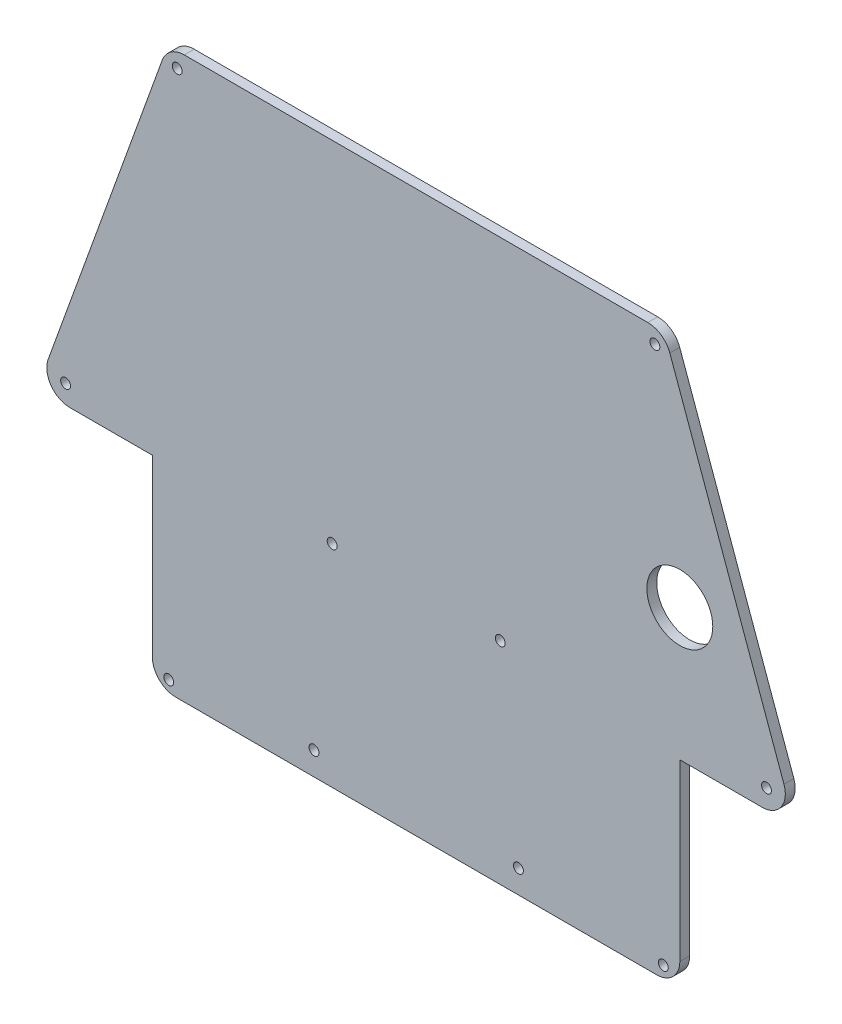
ISO-10303-21;
HEADER;
FILE_DESCRIPTION(('STEP AP214'),'2;1');
FILE_NAME('part.step','',(''),(''),'','','');
FILE_SCHEMA(('AUTOMOTIVE_DESIGN { 1 0 10303 214 1 1 1 1 }'));
ENDSEC;
DATA;
#1=APPLICATION_CONTEXT('core data for automotive mechanical design processes');
#2=APPLICATION_PROTOCOL_DEFINITION('international standard','automotive_design',2000,#1);
#3=PRODUCT_CONTEXT('',#1,'mechanical');
#4=PRODUCT('Part','Part','',(#3));
#5=PRODUCT_RELATED_PRODUCT_CATEGORY('part','',(#4));
#6=PRODUCT_DEFINITION_FORMATION('','',#4);
#7=PRODUCT_DEFINITION_CONTEXT('part definition',#1,'design');
#8=PRODUCT_DEFINITION('design','',#6,#7);
#9=PRODUCT_DEFINITION_SHAPE('','',#8);
#10=(LENGTH_UNIT() NAMED_UNIT(*) SI_UNIT(.MILLI.,.METRE.));
#11=(NAMED_UNIT(*) PLANE_ANGLE_UNIT() SI_UNIT($,.RADIAN.));
#12=(NAMED_UNIT(*) SI_UNIT($,.STERADIAN.) SOLID_ANGLE_UNIT());
#13=UNCERTAINTY_MEASURE_WITH_UNIT(LENGTH_MEASURE(1.E-05),#10,'distance_accuracy_value','');
#14=(GEOMETRIC_REPRESENTATION_CONTEXT(3) GLOBAL_UNCERTAINTY_ASSIGNED_CONTEXT((#13)) GLOBAL_UNIT_ASSIGNED_CONTEXT((#10,
#11,#12)) REPRESENTATION_CONTEXT('',''));
#15=CARTESIAN_POINT('',(0.,0.,0.));
#16=DIRECTION('',(0.,0.,1.));
#17=DIRECTION('',(1.,0.,0.));
#18=AXIS2_PLACEMENT_3D('',#15,#16,#17);
#19=CARTESIAN_POINT('',(105.000000000002,67.0000000000007,3.));
#20=DIRECTION('',(0.,0.,1.));
#21=DIRECTION('',(1.,0.,0.));
#22=AXIS2_PLACEMENT_3D('',#19,#20,#21);
#23=PLANE('',#22);
#24=CARTESIAN_POINT('',(75.0000000000019,3.55203370173264,3.));
#25=DIRECTION('',(0.,0.,1.));
#26=DIRECTION('',(-1.,0.,0.));
#27=AXIS2_PLACEMENT_3D('',#24,#25,#26);
#28=CIRCLE('',#27,1.50000000000001);
#29=CARTESIAN_POINT('',(73.5000000000019,3.55203370173264,3.));
#30=VERTEX_POINT('',#29);
#31=EDGE_CURVE('E347',#30,#30,#28,.T.);
#32=ORIENTED_EDGE('',*,*,#31,.F.);
#33=EDGE_LOOP('',(#32));
#34=FACE_BOUND('',#33,.T.);
#35=CARTESIAN_POINT('',(72.4413822321753,165.375717781692,3.));
#36=DIRECTION('',(0.,0.,1.));
#37=DIRECTION('',(-1.,0.,0.));
#38=AXIS2_PLACEMENT_3D('',#35,#36,#37);
#39=CIRCLE('',#38,1.5);
#40=CARTESIAN_POINT('',(70.9413822321753,165.375717781692,3.));
#41=VERTEX_POINT('',#40);
#42=EDGE_CURVE('E359',#41,#41,#39,.T.);
#43=ORIENTED_EDGE('',*,*,#42,.F.);
#44=EDGE_LOOP('',(#43));
#45=FACE_BOUND('',#44,.T.);
#46=CARTESIAN_POINT('',(-106.291485680485,65.7561376704463,3.));
#47=DIRECTION('',(0.,0.,1.));
#48=DIRECTION('',(1.,0.,0.));
#49=AXIS2_PLACEMENT_3D('',#46,#47,#48);
#50=CIRCLE('',#49,1.5);
#51=CARTESIAN_POINT('',(-104.791485680485,65.7561376704463,3.));
#52=VERTEX_POINT('',#51);
#53=EDGE_CURVE('E371',#52,#52,#50,.T.);
#54=ORIENTED_EDGE('',*,*,#53,.F.);
#55=EDGE_LOOP('',(#54));
#56=FACE_BOUND('',#55,.T.);
#57=CARTESIAN_POINT('',(25.5476923794889,64.0657499528872,3.));
#58=DIRECTION('',(0.,0.,1.));
#59=DIRECTION('',(-1.,0.,0.));
#60=AXIS2_PLACEMENT_3D('',#57,#58,#59);
#61=CIRCLE('',#60,1.5);
#62=CARTESIAN_POINT('',(24.0476923794889,64.0657499528872,3.));
#63=VERTEX_POINT('',#62);
#64=EDGE_CURVE('E383',#63,#63,#61,.T.);
#65=ORIENTED_EDGE('',*,*,#64,.F.);
#66=EDGE_LOOP('',(#65));
#67=FACE_BOUND('',#66,.T.);
#68=CARTESIAN_POINT('',(31.0476923794889,7.0657499528872,3.));
#69=DIRECTION('',(0.,0.,1.));
#70=DIRECTION('',(-1.,0.,0.));
#71=AXIS2_PLACEMENT_3D('',#68,#69,#70);
#72=CIRCLE('',#71,1.50000000000001);
#73=CARTESIAN_POINT('',(29.5476923794889,7.0657499528872,3.));
#74=VERTEX_POINT('',#73);
#75=EDGE_CURVE('E395',#74,#74,#72,.T.);
#76=ORIENTED_EDGE('',*,*,#75,.F.);
#77=EDGE_LOOP('',(#76));
#78=FACE_BOUND('',#77,.T.);
#79=CARTESIAN_POINT('',(105.000000000002,67.0000000000007,3.));
#80=DIRECTION('',(0.,0.,1.));
#81=DIRECTION('',(1.,0.,0.));
#82=AXIS2_PLACEMENT_3D('',#79,#80,#81);
#83=CIRCLE('',#82,7.00000000000002);
#84=CARTESIAN_POINT('',(105.000000000002,60.0000000000007,3.));
#85=VERTEX_POINT('',#84);
#86=CARTESIAN_POINT('',(111.584524661794,69.3757177816926,3.));
#87=VERTEX_POINT('',#86);
#88=EDGE_CURVE('E195',#85,#87,#83,.T.);
#89=ORIENTED_EDGE('',*,*,#88,.T.);
#90=DIRECTION('',(-0.33938825452742,0.940646380256062,0.));
#91=VECTOR('',#90,1.);
#92=CARTESIAN_POINT('',(111.584524661794,69.3757177816926,3.));
#93=LINE('',#92,#91);
#94=CARTESIAN_POINT('',(76.9701493915327,165.312705489575,3.));
#95=VERTEX_POINT('',#94);
#96=EDGE_CURVE('E113',#87,#95,#93,.T.);
#97=ORIENTED_EDGE('',*,*,#96,.T.);
#98=CARTESIAN_POINT('',(70.2959014014798,162.904615241026,3.));
#99=DIRECTION('',(0.,0.,1.));
#100=DIRECTION('',(1.,0.,0.));
#101=AXIS2_PLACEMENT_3D('',#98,#99,#100);
#102=CIRCLE('',#101,7.09538475897397);
#103=CARTESIAN_POINT('',(70.2959014014798,170.,3.));
#104=VERTEX_POINT('',#103);
#105=EDGE_CURVE('E228',#95,#104,#102,.T.);
#106=ORIENTED_EDGE('',*,*,#105,.T.);
#107=DIRECTION('',(-1.,0.,0.));
#108=VECTOR('',#107,1.);
#109=CARTESIAN_POINT('',(-70.295901401476,170.,3.));
#110=LINE('',#109,#108);
#111=CARTESIAN_POINT('',(-70.295901401476,170.,3.));
#112=VERTEX_POINT('',#111);
#113=EDGE_CURVE('E247',#104,#112,#110,.T.);
#114=ORIENTED_EDGE('',*,*,#113,.T.);
#115=CARTESIAN_POINT('',(-70.295901401476,162.904615241026,3.));
#116=DIRECTION('',(0.,0.,1.));
#117=DIRECTION('',(-1.,0.,0.));
#118=AXIS2_PLACEMENT_3D('',#115,#116,#117);
#119=CIRCLE('',#118,7.09538475897395);
#120=CARTESIAN_POINT('',(-76.9701493915289,165.312705489575,3.));
#121=VERTEX_POINT('',#120);
#122=EDGE_CURVE('E244',#112,#121,#119,.T.);
#123=ORIENTED_EDGE('',*,*,#122,.T.);
#124=DIRECTION('',(-0.339388254527417,-0.940646380256063,0.));
#125=VECTOR('',#124,1.);
#126=CARTESIAN_POINT('',(-111.584524661791,69.3757177816919,3.));
#127=LINE('',#126,#125);
#128=CARTESIAN_POINT('',(-111.584524661791,69.3757177816919,3.));
#129=VERTEX_POINT('',#128);
#130=EDGE_CURVE('E246',#121,#129,#127,.T.);
#131=ORIENTED_EDGE('',*,*,#130,.T.);
#132=CARTESIAN_POINT('',(-104.999999999998,67.,3.));
#133=DIRECTION('',(0.,0.,1.));
#134=DIRECTION('',(-1.,0.,0.));
#135=AXIS2_PLACEMENT_3D('',#132,#133,#134);
#136=CIRCLE('',#135,7.);
#137=CARTESIAN_POINT('',(-104.999999999998,60.,3.));
#138=VERTEX_POINT('',#137);
#139=EDGE_CURVE('E249',#129,#138,#136,.T.);
#140=ORIENTED_EDGE('',*,*,#139,.T.);
#141=DIRECTION('',(1.,0.,0.));
#142=VECTOR('',#141,1.);
#143=CARTESIAN_POINT('',(-79.9999999999981,60.,3.));
#144=LINE('',#143,#142);
#145=CARTESIAN_POINT('',(-79.9999999999981,60.,3.));
#146=VERTEX_POINT('',#145);
#147=EDGE_CURVE('E255',#138,#146,#144,.T.);
#148=ORIENTED_EDGE('',*,*,#147,.T.);
#149=DIRECTION('',(0.,-1.,0.));
#150=VECTOR('',#149,1.);
#151=CARTESIAN_POINT('',(-79.9999999999981,7.09538475897397,3.));
#152=LINE('',#151,#150);
#153=CARTESIAN_POINT('',(-79.9999999999981,7.09538475897397,3.));
#154=VERTEX_POINT('',#153);
#155=EDGE_CURVE('E257',#146,#154,#152,.T.);
#156=ORIENTED_EDGE('',*,*,#155,.T.);
#157=CARTESIAN_POINT('',(-72.9046152410241,7.09538475897397,3.));
#158=DIRECTION('',(0.,0.,1.));
#159=DIRECTION('',(1.,0.,0.));
#160=AXIS2_PLACEMENT_3D('',#157,#158,#159);
#161=CIRCLE('',#160,7.09538475897396);
#162=CARTESIAN_POINT('',(-72.9046152410241,0.,3.));
#163=VERTEX_POINT('',#162);
#164=EDGE_CURVE('E259',#154,#163,#161,.T.);
#165=ORIENTED_EDGE('',*,*,#164,.T.);
#166=DIRECTION('',(1.,0.,0.));
#167=VECTOR('',#166,1.);
#168=CARTESIAN_POINT('',(-72.9046152410241,0.,3.));
#169=LINE('',#168,#167);
#170=CARTESIAN_POINT('',(73.0000000000019,0.,3.));
#171=VERTEX_POINT('',#170);
#172=EDGE_CURVE('E150',#163,#171,#169,.T.);
#173=ORIENTED_EDGE('',*,*,#172,.T.);
#174=CARTESIAN_POINT('',(73.0000000000019,7.,3.));
#175=DIRECTION('',(0.,0.,1.));
#176=DIRECTION('',(1.,0.,0.));
#177=AXIS2_PLACEMENT_3D('',#174,#175,#176);
#178=CIRCLE('',#177,7.00000000000001);
#179=CARTESIAN_POINT('',(80.0000000000019,7.,3.));
#180=VERTEX_POINT('',#179);
#181=EDGE_CURVE('E144',#171,#180,#178,.T.);
#182=ORIENTED_EDGE('',*,*,#181,.T.);
#183=DIRECTION('',(0.,1.,0.));
#184=VECTOR('',#183,1.);
#185=CARTESIAN_POINT('',(80.0000000000019,7.,3.));
#186=LINE('',#185,#184);
#187=CARTESIAN_POINT('',(80.0000000000019,60.0000000000007,3.));
#188=VERTEX_POINT('',#187);
#189=EDGE_CURVE('E148',#180,#188,#186,.T.);
#190=ORIENTED_EDGE('',*,*,#189,.T.);
#191=DIRECTION('',(1.,0.,0.));
#192=VECTOR('',#191,1.);
#193=CARTESIAN_POINT('',(80.0000000000019,60.0000000000007,3.));
#194=LINE('',#193,#192);
#195=EDGE_CURVE('E52',#188,#85,#194,.T.);
#196=ORIENTED_EDGE('',*,*,#195,.T.);
#197=EDGE_LOOP('',(#89,#97,#106,#114,#123,#131,#140,#148,#156,#165,#173,#182,#190,#196));
#198=FACE_BOUND('',#197,.T.);
#199=CARTESIAN_POINT('',(-30.9523076205111,7.0657499528872,3.));
#200=DIRECTION('',(0.,0.,1.));
#201=DIRECTION('',(1.,0.,0.));
#202=AXIS2_PLACEMENT_3D('',#199,#200,#201);
#203=CIRCLE('',#202,1.5);
#204=CARTESIAN_POINT('',(-29.4523076205111,7.0657499528872,3.));
#205=VERTEX_POINT('',#204);
#206=EDGE_CURVE('E172',#205,#205,#203,.T.);
#207=ORIENTED_EDGE('',*,*,#206,.F.);
#208=EDGE_LOOP('',(#207));
#209=FACE_BOUND('',#208,.T.);
#210=CARTESIAN_POINT('',(-25.4523076205111,64.0657499528872,3.));
#211=DIRECTION('',(0.,0.,1.));
#212=DIRECTION('',(1.,0.,0.));
#213=AXIS2_PLACEMENT_3D('',#210,#211,#212);
#214=CIRCLE('',#213,1.5);
#215=CARTESIAN_POINT('',(-23.9523076205111,64.0657499528872,3.));
#216=VERTEX_POINT('',#215);
#217=EDGE_CURVE('E389',#216,#216,#214,.T.);
#218=ORIENTED_EDGE('',*,*,#217,.F.);
#219=EDGE_LOOP('',(#218));
#220=FACE_BOUND('',#219,.T.);
#221=CARTESIAN_POINT('',(-74.9999999999981,3.55203370173264,3.));
#222=DIRECTION('',(0.,0.,1.));
#223=DIRECTION('',(1.,0.,0.));
#224=AXIS2_PLACEMENT_3D('',#221,#222,#223);
#225=CIRCLE('',#224,1.50000000000001);
#226=CARTESIAN_POINT('',(-73.4999999999981,3.55203370173264,3.));
#227=VERTEX_POINT('',#226);
#228=EDGE_CURVE('E377',#227,#227,#225,.T.);
#229=ORIENTED_EDGE('',*,*,#228,.F.);
#230=EDGE_LOOP('',(#229));
#231=FACE_BOUND('',#230,.T.);
#232=CARTESIAN_POINT('',(106.291485680488,65.7561376704463,3.));
#233=DIRECTION('',(0.,0.,1.));
#234=DIRECTION('',(-1.,0.,0.));
#235=AXIS2_PLACEMENT_3D('',#232,#233,#234);
#236=CIRCLE('',#235,1.5);
#237=CARTESIAN_POINT('',(104.791485680488,65.7561376704463,3.));
#238=VERTEX_POINT('',#237);
#239=EDGE_CURVE('E365',#238,#238,#236,.T.);
#240=ORIENTED_EDGE('',*,*,#239,.F.);
#241=EDGE_LOOP('',(#240));
#242=FACE_BOUND('',#241,.T.);
#243=CARTESIAN_POINT('',(-72.4413822321716,165.375717781692,3.));
#244=DIRECTION('',(0.,0.,1.));
#245=DIRECTION('',(1.,0.,0.));
#246=AXIS2_PLACEMENT_3D('',#243,#244,#245);
#247=CIRCLE('',#246,1.5);
#248=CARTESIAN_POINT('',(-70.9413822321716,165.375717781692,3.));
#249=VERTEX_POINT('',#248);
#250=EDGE_CURVE('E353',#249,#249,#247,.T.);
#251=ORIENTED_EDGE('',*,*,#250,.F.);
#252=EDGE_LOOP('',(#251));
#253=FACE_BOUND('',#252,.T.);
#254=CARTESIAN_POINT('',(80.0000000000019,100.000000000001,3.));
#255=DIRECTION('',(0.,0.,1.));
#256=DIRECTION('',(1.,0.,0.));
#257=AXIS2_PLACEMENT_3D('',#254,#255,#256);
#258=CIRCLE('',#257,10.);
#259=CARTESIAN_POINT('',(90.0000000000019,100.000000000001,3.));
#260=VERTEX_POINT('',#259);
#261=EDGE_CURVE('E338',#260,#260,#258,.T.);
#262=ORIENTED_EDGE('',*,*,#261,.F.);
#263=EDGE_LOOP('',(#262));
#264=FACE_BOUND('',#263,.T.);
#265=ADVANCED_FACE('F35',(#34,#45,#56,#67,#78,#198,#209,#220,#231,#242,#253,#264),#23,.T.);
#266=CARTESIAN_POINT('',(105.000000000002,67.0000000000007,0.));
#267=DIRECTION('',(0.,0.,1.));
#268=DIRECTION('',(1.,0.,0.));
#269=AXIS2_PLACEMENT_3D('',#266,#267,#268);
#270=PLANE('',#269);
#271=CARTESIAN_POINT('',(105.000000000002,67.0000000000007,0.));
#272=DIRECTION('',(0.,0.,1.));
#273=DIRECTION('',(1.,0.,0.));
#274=AXIS2_PLACEMENT_3D('',#271,#272,#273);
#275=CIRCLE('',#274,7.00000000000002);
#276=CARTESIAN_POINT('',(105.000000000002,60.0000000000007,0.));
#277=VERTEX_POINT('',#276);
#278=CARTESIAN_POINT('',(111.584524661794,69.3757177816926,0.));
#279=VERTEX_POINT('',#278);
#280=EDGE_CURVE('E168',#277,#279,#275,.T.);
#281=ORIENTED_EDGE('',*,*,#280,.F.);
#282=DIRECTION('',(1.,0.,0.));
#283=VECTOR('',#282,1.);
#284=CARTESIAN_POINT('',(80.0000000000019,60.0000000000007,0.));
#285=LINE('',#284,#283);
#286=CARTESIAN_POINT('',(80.0000000000019,60.0000000000007,0.));
#287=VERTEX_POINT('',#286);
#288=EDGE_CURVE('E105',#287,#277,#285,.T.);
#289=ORIENTED_EDGE('',*,*,#288,.F.);
#290=DIRECTION('',(0.,1.,0.));
#291=VECTOR('',#290,1.);
#292=CARTESIAN_POINT('',(80.0000000000019,7.,0.));
#293=LINE('',#292,#291);
#294=CARTESIAN_POINT('',(80.0000000000019,7.,0.));
#295=VERTEX_POINT('',#294);
#296=EDGE_CURVE('E99',#295,#287,#293,.T.);
#297=ORIENTED_EDGE('',*,*,#296,.F.);
#298=CARTESIAN_POINT('',(73.0000000000019,7.,0.));
#299=DIRECTION('',(0.,0.,1.));
#300=DIRECTION('',(1.,0.,0.));
#301=AXIS2_PLACEMENT_3D('',#298,#299,#300);
#302=CIRCLE('',#301,7.00000000000001);
#303=CARTESIAN_POINT('',(73.0000000000019,0.,0.));
#304=VERTEX_POINT('',#303);
#305=EDGE_CURVE('E158',#304,#295,#302,.T.);
#306=ORIENTED_EDGE('',*,*,#305,.F.);
#307=DIRECTION('',(1.,0.,0.));
#308=VECTOR('',#307,1.);
#309=CARTESIAN_POINT('',(-72.9046152410241,0.,0.));
#310=LINE('',#309,#308);
#311=CARTESIAN_POINT('',(-72.9046152410241,0.,0.));
#312=VERTEX_POINT('',#311);
#313=EDGE_CURVE('E190',#312,#304,#310,.T.);
#314=ORIENTED_EDGE('',*,*,#313,.F.);
#315=CARTESIAN_POINT('',(-72.9046152410241,7.09538475897397,0.));
#316=DIRECTION('',(0.,0.,1.));
#317=DIRECTION('',(1.,0.,0.));
#318=AXIS2_PLACEMENT_3D('',#315,#316,#317);
#319=CIRCLE('',#318,7.09538475897396);
#320=CARTESIAN_POINT('',(-79.9999999999981,7.09538475897397,0.));
#321=VERTEX_POINT('',#320);
#322=EDGE_CURVE('E188',#321,#312,#319,.T.);
#323=ORIENTED_EDGE('',*,*,#322,.F.);
#324=DIRECTION('',(0.,-1.,0.));
#325=VECTOR('',#324,1.);
#326=CARTESIAN_POINT('',(-79.9999999999981,7.09538475897397,0.));
#327=LINE('',#326,#325);
#328=CARTESIAN_POINT('',(-79.9999999999981,60.,0.));
#329=VERTEX_POINT('',#328);
#330=EDGE_CURVE('E186',#329,#321,#327,.T.);
#331=ORIENTED_EDGE('',*,*,#330,.F.);
#332=DIRECTION('',(1.,0.,0.));
#333=VECTOR('',#332,1.);
#334=CARTESIAN_POINT('',(-79.9999999999981,60.,0.));
#335=LINE('',#334,#333);
#336=CARTESIAN_POINT('',(-104.999999999998,60.,0.));
#337=VERTEX_POINT('',#336);
#338=EDGE_CURVE('E184',#337,#329,#335,.T.);
#339=ORIENTED_EDGE('',*,*,#338,.F.);
#340=CARTESIAN_POINT('',(-104.999999999998,67.,0.));
#341=DIRECTION('',(0.,0.,1.));
#342=DIRECTION('',(-1.,0.,0.));
#343=AXIS2_PLACEMENT_3D('',#340,#341,#342);
#344=CIRCLE('',#343,7.);
#345=CARTESIAN_POINT('',(-111.584524661791,69.3757177816919,0.));
#346=VERTEX_POINT('',#345);
#347=EDGE_CURVE('E182',#346,#337,#344,.T.);
#348=ORIENTED_EDGE('',*,*,#347,.F.);
#349=DIRECTION('',(-0.339388254527417,-0.940646380256063,0.));
#350=VECTOR('',#349,1.);
#351=CARTESIAN_POINT('',(-111.584524661791,69.3757177816919,0.));
#352=LINE('',#351,#350);
#353=CARTESIAN_POINT('',(-76.9701493915289,165.312705489575,0.));
#354=VERTEX_POINT('',#353);
#355=EDGE_CURVE('E180',#354,#346,#352,.T.);
#356=ORIENTED_EDGE('',*,*,#355,.F.);
#357=CARTESIAN_POINT('',(-70.295901401476,162.904615241026,0.));
#358=DIRECTION('',(0.,0.,1.));
#359=DIRECTION('',(-1.,0.,0.));
#360=AXIS2_PLACEMENT_3D('',#357,#358,#359);
#361=CIRCLE('',#360,7.09538475897395);
#362=CARTESIAN_POINT('',(-70.295901401476,170.,0.));
#363=VERTEX_POINT('',#362);
#364=EDGE_CURVE('E178',#363,#354,#361,.T.);
#365=ORIENTED_EDGE('',*,*,#364,.F.);
#366=DIRECTION('',(-1.,0.,0.));
#367=VECTOR('',#366,1.);
#368=CARTESIAN_POINT('',(-70.295901401476,170.,0.));
#369=LINE('',#368,#367);
#370=CARTESIAN_POINT('',(70.2959014014798,170.,0.));
#371=VERTEX_POINT('',#370);
#372=EDGE_CURVE('E176',#371,#363,#369,.T.);
#373=ORIENTED_EDGE('',*,*,#372,.F.);
#374=CARTESIAN_POINT('',(70.2959014014798,162.904615241026,0.));
#375=DIRECTION('',(0.,0.,1.));
#376=DIRECTION('',(1.,0.,0.));
#377=AXIS2_PLACEMENT_3D('',#374,#375,#376);
#378=CIRCLE('',#377,7.09538475897397);
#379=CARTESIAN_POINT('',(76.9701493915327,165.312705489575,0.));
#380=VERTEX_POINT('',#379);
#381=EDGE_CURVE('E174',#380,#371,#378,.T.);
#382=ORIENTED_EDGE('',*,*,#381,.F.);
#383=DIRECTION('',(-0.33938825452742,0.940646380256062,0.));
#384=VECTOR('',#383,1.);
#385=CARTESIAN_POINT('',(111.584524661794,69.3757177816926,0.));
#386=LINE('',#385,#384);
#387=EDGE_CURVE('E171',#279,#380,#386,.T.);
#388=ORIENTED_EDGE('',*,*,#387,.F.);
#389=EDGE_LOOP('',(#281,#289,#297,#306,#314,#323,#331,#339,#348,#356,#365,#373,#382,#388));
#390=FACE_BOUND('',#389,.T.);
#391=CARTESIAN_POINT('',(-30.9523076205111,7.0657499528872,0.));
#392=DIRECTION('',(0.,0.,1.));
#393=DIRECTION('',(1.,0.,0.));
#394=AXIS2_PLACEMENT_3D('',#391,#392,#393);
#395=CIRCLE('',#394,1.5);
#396=CARTESIAN_POINT('',(-29.4523076205111,7.0657499528872,0.));
#397=VERTEX_POINT('',#396);
#398=EDGE_CURVE('E398',#397,#397,#395,.T.);
#399=ORIENTED_EDGE('',*,*,#398,.T.);
#400=EDGE_LOOP('',(#399));
#401=FACE_BOUND('',#400,.T.);
#402=CARTESIAN_POINT('',(31.0476923794889,7.0657499528872,0.));
#403=DIRECTION('',(0.,0.,1.));
#404=DIRECTION('',(-1.,0.,0.));
#405=AXIS2_PLACEMENT_3D('',#402,#403,#404);
#406=CIRCLE('',#405,1.50000000000001);
#407=CARTESIAN_POINT('',(29.5476923794889,7.0657499528872,0.));
#408=VERTEX_POINT('',#407);
#409=EDGE_CURVE('E392',#408,#408,#406,.T.);
#410=ORIENTED_EDGE('',*,*,#409,.T.);
#411=EDGE_LOOP('',(#410));
#412=FACE_BOUND('',#411,.T.);
#413=CARTESIAN_POINT('',(-25.4523076205111,64.0657499528872,0.));
#414=DIRECTION('',(0.,0.,1.));
#415=DIRECTION('',(1.,0.,0.));
#416=AXIS2_PLACEMENT_3D('',#413,#414,#415);
#417=CIRCLE('',#416,1.5);
#418=CARTESIAN_POINT('',(-23.9523076205111,64.0657499528872,0.));
#419=VERTEX_POINT('',#418);
#420=EDGE_CURVE('E386',#419,#419,#417,.T.);
#421=ORIENTED_EDGE('',*,*,#420,.T.);
#422=EDGE_LOOP('',(#421));
#423=FACE_BOUND('',#422,.T.);
#424=CARTESIAN_POINT('',(25.5476923794889,64.0657499528872,0.));
#425=DIRECTION('',(0.,0.,1.));
#426=DIRECTION('',(-1.,0.,0.));
#427=AXIS2_PLACEMENT_3D('',#424,#425,#426);
#428=CIRCLE('',#427,1.5);
#429=CARTESIAN_POINT('',(24.0476923794889,64.0657499528872,0.));
#430=VERTEX_POINT('',#429);
#431=EDGE_CURVE('E380',#430,#430,#428,.T.);
#432=ORIENTED_EDGE('',*,*,#431,.T.);
#433=EDGE_LOOP('',(#432));
#434=FACE_BOUND('',#433,.T.);
#435=CARTESIAN_POINT('',(-74.9999999999981,3.55203370173264,0.));
#436=DIRECTION('',(0.,0.,1.));
#437=DIRECTION('',(1.,0.,0.));
#438=AXIS2_PLACEMENT_3D('',#435,#436,#437);
#439=CIRCLE('',#438,1.50000000000001);
#440=CARTESIAN_POINT('',(-73.4999999999981,3.55203370173264,0.));
#441=VERTEX_POINT('',#440);
#442=EDGE_CURVE('E374',#441,#441,#439,.T.);
#443=ORIENTED_EDGE('',*,*,#442,.T.);
#444=EDGE_LOOP('',(#443));
#445=FACE_BOUND('',#444,.T.);
#446=CARTESIAN_POINT('',(-106.291485680485,65.7561376704463,0.));
#447=DIRECTION('',(0.,0.,1.));
#448=DIRECTION('',(1.,0.,0.));
#449=AXIS2_PLACEMENT_3D('',#446,#447,#448);
#450=CIRCLE('',#449,1.5);
#451=CARTESIAN_POINT('',(-104.791485680485,65.7561376704463,0.));
#452=VERTEX_POINT('',#451);
#453=EDGE_CURVE('E368',#452,#452,#450,.T.);
#454=ORIENTED_EDGE('',*,*,#453,.T.);
#455=EDGE_LOOP('',(#454));
#456=FACE_BOUND('',#455,.T.);
#457=CARTESIAN_POINT('',(106.291485680488,65.7561376704463,0.));
#458=DIRECTION('',(0.,0.,1.));
#459=DIRECTION('',(-1.,0.,0.));
#460=AXIS2_PLACEMENT_3D('',#457,#458,#459);
#461=CIRCLE('',#460,1.5);
#462=CARTESIAN_POINT('',(104.791485680488,65.7561376704463,0.));
#463=VERTEX_POINT('',#462);
#464=EDGE_CURVE('E362',#463,#463,#461,.T.);
#465=ORIENTED_EDGE('',*,*,#464,.T.);
#466=EDGE_LOOP('',(#465));
#467=FACE_BOUND('',#466,.T.);
#468=CARTESIAN_POINT('',(72.4413822321753,165.375717781692,0.));
#469=DIRECTION('',(0.,0.,1.));
#470=DIRECTION('',(-1.,0.,0.));
#471=AXIS2_PLACEMENT_3D('',#468,#469,#470);
#472=CIRCLE('',#471,1.5);
#473=CARTESIAN_POINT('',(70.9413822321753,165.375717781692,0.));
#474=VERTEX_POINT('',#473);
#475=EDGE_CURVE('E356',#474,#474,#472,.T.);
#476=ORIENTED_EDGE('',*,*,#475,.T.);
#477=EDGE_LOOP('',(#476));
#478=FACE_BOUND('',#477,.T.);
#479=CARTESIAN_POINT('',(-72.4413822321716,165.375717781692,0.));
#480=DIRECTION('',(0.,0.,1.));
#481=DIRECTION('',(1.,0.,0.));
#482=AXIS2_PLACEMENT_3D('',#479,#480,#481);
#483=CIRCLE('',#482,1.5);
#484=CARTESIAN_POINT('',(-70.9413822321716,165.375717781692,0.));
#485=VERTEX_POINT('',#484);
#486=EDGE_CURVE('E350',#485,#485,#483,.T.);
#487=ORIENTED_EDGE('',*,*,#486,.T.);
#488=EDGE_LOOP('',(#487));
#489=FACE_BOUND('',#488,.T.);
#490=CARTESIAN_POINT('',(75.0000000000019,3.55203370173264,0.));
#491=DIRECTION('',(0.,0.,1.));
#492=DIRECTION('',(-1.,0.,0.));
#493=AXIS2_PLACEMENT_3D('',#490,#491,#492);
#494=CIRCLE('',#493,1.50000000000001);
#495=CARTESIAN_POINT('',(73.5000000000019,3.55203370173264,0.));
#496=VERTEX_POINT('',#495);
#497=EDGE_CURVE('E344',#496,#496,#494,.T.);
#498=ORIENTED_EDGE('',*,*,#497,.T.);
#499=EDGE_LOOP('',(#498));
#500=FACE_BOUND('',#499,.T.);
#501=CARTESIAN_POINT('',(80.0000000000019,100.000000000001,0.));
#502=DIRECTION('',(0.,0.,1.));
#503=DIRECTION('',(1.,0.,0.));
#504=AXIS2_PLACEMENT_3D('',#501,#502,#503);
#505=CIRCLE('',#504,10.);
#506=CARTESIAN_POINT('',(90.0000000000019,100.000000000001,0.));
#507=VERTEX_POINT('',#506);
#508=EDGE_CURVE('E341',#507,#507,#505,.T.);
#509=ORIENTED_EDGE('',*,*,#508,.T.);
#510=EDGE_LOOP('',(#509));
#511=FACE_BOUND('',#510,.T.);
#512=ADVANCED_FACE('F232',(#390,#401,#412,#423,#434,#445,#456,#467,#478,#489,#500,#511),#270,.F.);
#513=CARTESIAN_POINT('',(105.000000000002,67.0000000000007,3.));
#514=DIRECTION('',(0.,0.,-1.));
#515=DIRECTION('',(-1.,0.,0.));
#516=AXIS2_PLACEMENT_3D('',#513,#514,#515);
#517=CYLINDRICAL_SURFACE('',#516,7.00000000000002);
#518=ORIENTED_EDGE('',*,*,#280,.T.);
#519=DIRECTION('',(0.,0.,-1.));
#520=VECTOR('',#519,1.);
#521=CARTESIAN_POINT('',(111.584524661794,69.3757177816926,3.));
#522=LINE('',#521,#520);
#523=EDGE_CURVE('E11',#87,#279,#522,.T.);
#524=ORIENTED_EDGE('',*,*,#523,.F.);
#525=ORIENTED_EDGE('',*,*,#88,.F.);
#526=DIRECTION('',(0.,0.,-1.));
#527=VECTOR('',#526,1.);
#528=CARTESIAN_POINT('',(105.000000000002,60.0000000000007,3.));
#529=LINE('',#528,#527);
#530=EDGE_CURVE('E164',#85,#277,#529,.T.);
#531=ORIENTED_EDGE('',*,*,#530,.T.);
#532=EDGE_LOOP('',(#518,#524,#525,#531));
#533=FACE_BOUND('',#532,.T.);
#534=ADVANCED_FACE('F37',(#533),#517,.T.);
#535=CARTESIAN_POINT('',(111.584524661794,69.3757177816926,3.));
#536=DIRECTION('',(-0.940646380256062,-0.33938825452742,0.));
#537=DIRECTION('',(0.33938825452742,-0.940646380256062,0.));
#538=AXIS2_PLACEMENT_3D('',#535,#536,#537);
#539=PLANE('',#538);
#540=ORIENTED_EDGE('',*,*,#387,.T.);
#541=DIRECTION('',(0.,0.,-1.));
#542=VECTOR('',#541,1.);
#543=CARTESIAN_POINT('',(76.9701493915327,165.312705489575,3.));
#544=LINE('',#543,#542);
#545=EDGE_CURVE('E44',#95,#380,#544,.T.);
#546=ORIENTED_EDGE('',*,*,#545,.F.);
#547=ORIENTED_EDGE('',*,*,#96,.F.);
#548=ORIENTED_EDGE('',*,*,#523,.T.);
#549=EDGE_LOOP('',(#540,#546,#547,#548));
#550=FACE_BOUND('',#549,.T.);
#551=ADVANCED_FACE('F591',(#550),#539,.F.);
#552=CARTESIAN_POINT('',(70.2959014014798,162.904615241026,3.));
#553=DIRECTION('',(0.,0.,-1.));
#554=DIRECTION('',(-1.,0.,0.));
#555=AXIS2_PLACEMENT_3D('',#552,#553,#554);
#556=CYLINDRICAL_SURFACE('',#555,7.09538475897397);
#557=ORIENTED_EDGE('',*,*,#381,.T.);
#558=DIRECTION('',(0.,0.,-1.));
#559=VECTOR('',#558,1.);
#560=CARTESIAN_POINT('',(70.2959014014798,170.,3.));
#561=LINE('',#560,#559);
#562=EDGE_CURVE('E220',#104,#371,#561,.T.);
#563=ORIENTED_EDGE('',*,*,#562,.F.);
#564=ORIENTED_EDGE('',*,*,#105,.F.);
#565=ORIENTED_EDGE('',*,*,#545,.T.);
#566=EDGE_LOOP('',(#557,#563,#564,#565));
#567=FACE_BOUND('',#566,.T.);
#568=ADVANCED_FACE('F226',(#567),#556,.T.);
#569=CARTESIAN_POINT('',(-70.295901401476,170.,3.));
#570=DIRECTION('',(0.,-1.,0.));
#571=DIRECTION('',(0.,0.,-1.));
#572=AXIS2_PLACEMENT_3D('',#569,#570,#571);
#573=PLANE('',#572);
#574=ORIENTED_EDGE('',*,*,#372,.T.);
#575=DIRECTION('',(0.,0.,-1.));
#576=VECTOR('',#575,1.);
#577=CARTESIAN_POINT('',(-70.295901401476,170.,3.));
#578=LINE('',#577,#576);
#579=EDGE_CURVE('E217',#112,#363,#578,.T.);
#580=ORIENTED_EDGE('',*,*,#579,.F.);
#581=ORIENTED_EDGE('',*,*,#113,.F.);
#582=ORIENTED_EDGE('',*,*,#562,.T.);
#583=EDGE_LOOP('',(#574,#580,#581,#582));
#584=FACE_BOUND('',#583,.T.);
#585=ADVANCED_FACE('F238',(#584),#573,.F.);
#586=CARTESIAN_POINT('',(-70.295901401476,162.904615241026,3.));
#587=DIRECTION('',(0.,0.,-1.));
#588=DIRECTION('',(-1.,0.,0.));
#589=AXIS2_PLACEMENT_3D('',#586,#587,#588);
#590=CYLINDRICAL_SURFACE('',#589,7.09538475897395);
#591=ORIENTED_EDGE('',*,*,#364,.T.);
#592=DIRECTION('',(0.,0.,-1.));
#593=VECTOR('',#592,1.);
#594=CARTESIAN_POINT('',(-76.9701493915289,165.312705489575,3.));
#595=LINE('',#594,#593);
#596=EDGE_CURVE('E214',#121,#354,#595,.T.);
#597=ORIENTED_EDGE('',*,*,#596,.F.);
#598=ORIENTED_EDGE('',*,*,#122,.F.);
#599=ORIENTED_EDGE('',*,*,#579,.T.);
#600=EDGE_LOOP('',(#591,#597,#598,#599));
#601=FACE_BOUND('',#600,.T.);
#602=ADVANCED_FACE('F242',(#601),#590,.T.);
#603=CARTESIAN_POINT('',(-111.584524661791,69.3757177816919,3.));
#604=DIRECTION('',(0.940646380256063,-0.339388254527417,0.));
#605=DIRECTION('',(0.339388254527417,0.940646380256063,0.));
#606=AXIS2_PLACEMENT_3D('',#603,#604,#605);
#607=PLANE('',#606);
#608=ORIENTED_EDGE('',*,*,#355,.T.);
#609=DIRECTION('',(0.,0.,-1.));
#610=VECTOR('',#609,1.);
#611=CARTESIAN_POINT('',(-111.584524661791,69.3757177816919,3.));
#612=LINE('',#611,#610);
#613=EDGE_CURVE('E211',#129,#346,#612,.T.);
#614=ORIENTED_EDGE('',*,*,#613,.F.);
#615=ORIENTED_EDGE('',*,*,#130,.F.);
#616=ORIENTED_EDGE('',*,*,#596,.T.);
#617=EDGE_LOOP('',(#608,#614,#615,#616));
#618=FACE_BOUND('',#617,.T.);
#619=ADVANCED_FACE('F556',(#618),#607,.F.);
#620=CARTESIAN_POINT('',(-104.999999999998,67.,3.));
#621=DIRECTION('',(0.,0.,-1.));
#622=DIRECTION('',(-1.,0.,0.));
#623=AXIS2_PLACEMENT_3D('',#620,#621,#622);
#624=CYLINDRICAL_SURFACE('',#623,7.);
#625=ORIENTED_EDGE('',*,*,#347,.T.);
#626=DIRECTION('',(0.,0.,-1.));
#627=VECTOR('',#626,1.);
#628=CARTESIAN_POINT('',(-104.999999999998,60.,3.));
#629=LINE('',#628,#627);
#630=EDGE_CURVE('E208',#138,#337,#629,.T.);
#631=ORIENTED_EDGE('',*,*,#630,.F.);
#632=ORIENTED_EDGE('',*,*,#139,.F.);
#633=ORIENTED_EDGE('',*,*,#613,.T.);
#634=EDGE_LOOP('',(#625,#631,#632,#633));
#635=FACE_BOUND('',#634,.T.);
#636=ADVANCED_FACE('F546',(#635),#624,.T.);
#637=CARTESIAN_POINT('',(-79.9999999999981,60.,3.));
#638=DIRECTION('',(0.,1.,0.));
#639=DIRECTION('',(0.,0.,1.));
#640=AXIS2_PLACEMENT_3D('',#637,#638,#639);
#641=PLANE('',#640);
#642=ORIENTED_EDGE('',*,*,#338,.T.);
#643=DIRECTION('',(0.,0.,-1.));
#644=VECTOR('',#643,1.);
#645=CARTESIAN_POINT('',(-79.9999999999981,60.,3.));
#646=LINE('',#645,#644);
#647=EDGE_CURVE('E205',#146,#329,#646,.T.);
#648=ORIENTED_EDGE('',*,*,#647,.F.);
#649=ORIENTED_EDGE('',*,*,#147,.F.);
#650=ORIENTED_EDGE('',*,*,#630,.T.);
#651=EDGE_LOOP('',(#642,#648,#649,#650));
#652=FACE_BOUND('',#651,.T.);
#653=ADVANCED_FACE('F536',(#652),#641,.F.);
#654=CARTESIAN_POINT('',(-79.9999999999981,7.09538475897397,3.));
#655=DIRECTION('',(1.,0.,0.));
#656=DIRECTION('',(0.,1.,0.));
#657=AXIS2_PLACEMENT_3D('',#654,#655,#656);
#658=PLANE('',#657);
#659=ORIENTED_EDGE('',*,*,#330,.T.);
#660=DIRECTION('',(0.,0.,-1.));
#661=VECTOR('',#660,1.);
#662=CARTESIAN_POINT('',(-79.9999999999981,7.09538475897397,3.));
#663=LINE('',#662,#661);
#664=EDGE_CURVE('E202',#154,#321,#663,.T.);
#665=ORIENTED_EDGE('',*,*,#664,.F.);
#666=ORIENTED_EDGE('',*,*,#155,.F.);
#667=ORIENTED_EDGE('',*,*,#647,.T.);
#668=EDGE_LOOP('',(#659,#665,#666,#667));
#669=FACE_BOUND('',#668,.T.);
#670=ADVANCED_FACE('F527',(#669),#658,.F.);
#671=CARTESIAN_POINT('',(-72.9046152410241,7.09538475897397,3.));
#672=DIRECTION('',(0.,0.,-1.));
#673=DIRECTION('',(-1.,0.,0.));
#674=AXIS2_PLACEMENT_3D('',#671,#672,#673);
#675=CYLINDRICAL_SURFACE('',#674,7.09538475897396);
#676=ORIENTED_EDGE('',*,*,#322,.T.);
#677=DIRECTION('',(0.,0.,-1.));
#678=VECTOR('',#677,1.);
#679=CARTESIAN_POINT('',(-72.9046152410241,0.,3.));
#680=LINE('',#679,#678);
#681=EDGE_CURVE('E199',#163,#312,#680,.T.);
#682=ORIENTED_EDGE('',*,*,#681,.F.);
#683=ORIENTED_EDGE('',*,*,#164,.F.);
#684=ORIENTED_EDGE('',*,*,#664,.T.);
#685=EDGE_LOOP('',(#676,#682,#683,#684));
#686=FACE_BOUND('',#685,.T.);
#687=ADVANCED_FACE('F265',(#686),#675,.T.);
#688=CARTESIAN_POINT('',(-72.9046152410241,0.,3.));
#689=DIRECTION('',(0.,1.,0.));
#690=DIRECTION('',(0.,0.,1.));
#691=AXIS2_PLACEMENT_3D('',#688,#689,#690);
#692=PLANE('',#691);
#693=ORIENTED_EDGE('',*,*,#313,.T.);
#694=DIRECTION('',(0.,0.,-1.));
#695=VECTOR('',#694,1.);
#696=CARTESIAN_POINT('',(73.0000000000019,0.,3.));
#697=LINE('',#696,#695);
#698=EDGE_CURVE('E159',#171,#304,#697,.T.);
#699=ORIENTED_EDGE('',*,*,#698,.F.);
#700=ORIENTED_EDGE('',*,*,#172,.F.);
#701=ORIENTED_EDGE('',*,*,#681,.T.);
#702=EDGE_LOOP('',(#693,#699,#700,#701));
#703=FACE_BOUND('',#702,.T.);
#704=ADVANCED_FACE('F269',(#703),#692,.F.);
#705=CARTESIAN_POINT('',(73.0000000000019,7.,3.));
#706=DIRECTION('',(0.,0.,-1.));
#707=DIRECTION('',(-1.,0.,0.));
#708=AXIS2_PLACEMENT_3D('',#705,#706,#707);
#709=CYLINDRICAL_SURFACE('',#708,7.00000000000001);
#710=ORIENTED_EDGE('',*,*,#305,.T.);
#711=DIRECTION('',(0.,0.,-1.));
#712=VECTOR('',#711,1.);
#713=CARTESIAN_POINT('',(80.0000000000019,7.,3.));
#714=LINE('',#713,#712);
#715=EDGE_CURVE('E155',#180,#295,#714,.T.);
#716=ORIENTED_EDGE('',*,*,#715,.F.);
#717=ORIENTED_EDGE('',*,*,#181,.F.);
#718=ORIENTED_EDGE('',*,*,#698,.T.);
#719=EDGE_LOOP('',(#710,#716,#717,#718));
#720=FACE_BOUND('',#719,.T.);
#721=ADVANCED_FACE('F156',(#720),#709,.T.);
#722=CARTESIAN_POINT('',(80.0000000000019,7.,3.));
#723=DIRECTION('',(-1.,0.,0.));
#724=DIRECTION('',(0.,-1.,0.));
#725=AXIS2_PLACEMENT_3D('',#722,#723,#724);
#726=PLANE('',#725);
#727=ORIENTED_EDGE('',*,*,#296,.T.);
#728=DIRECTION('',(0.,0.,-1.));
#729=VECTOR('',#728,1.);
#730=CARTESIAN_POINT('',(80.0000000000019,60.0000000000007,3.));
#731=LINE('',#730,#729);
#732=EDGE_CURVE('E160',#188,#287,#731,.T.);
#733=ORIENTED_EDGE('',*,*,#732,.F.);
#734=ORIENTED_EDGE('',*,*,#189,.F.);
#735=ORIENTED_EDGE('',*,*,#715,.T.);
#736=EDGE_LOOP('',(#727,#733,#734,#735));
#737=FACE_BOUND('',#736,.T.);
#738=ADVANCED_FACE('F162',(#737),#726,.F.);
#739=CARTESIAN_POINT('',(80.0000000000019,60.0000000000007,3.));
#740=DIRECTION('',(0.,1.,0.));
#741=DIRECTION('',(-1.,0.,0.));
#742=AXIS2_PLACEMENT_3D('',#739,#740,#741);
#743=PLANE('',#742);
#744=ORIENTED_EDGE('',*,*,#288,.T.);
#745=ORIENTED_EDGE('',*,*,#530,.F.);
#746=ORIENTED_EDGE('',*,*,#195,.F.);
#747=ORIENTED_EDGE('',*,*,#732,.T.);
#748=EDGE_LOOP('',(#744,#745,#746,#747));
#749=FACE_BOUND('',#748,.T.);
#750=ADVANCED_FACE('F273',(#749),#743,.F.);
#751=CARTESIAN_POINT('',(-30.9523076205111,7.0657499528872,3.));
#752=DIRECTION('',(0.,0.,-1.));
#753=DIRECTION('',(-1.,0.,0.));
#754=AXIS2_PLACEMENT_3D('',#751,#752,#753);
#755=CYLINDRICAL_SURFACE('',#754,1.5);
#756=ORIENTED_EDGE('',*,*,#206,.T.);
#757=EDGE_LOOP('',(#756));
#758=FACE_BOUND('',#757,.T.);
#759=ORIENTED_EDGE('',*,*,#398,.F.);
#760=EDGE_LOOP('',(#759));
#761=FACE_BOUND('',#760,.T.);
#762=ADVANCED_FACE('F275',(#758,#761),#755,.F.);
#763=CARTESIAN_POINT('',(31.0476923794889,7.0657499528872,3.));
#764=DIRECTION('',(0.,0.,-1.));
#765=DIRECTION('',(-1.,0.,0.));
#766=AXIS2_PLACEMENT_3D('',#763,#764,#765);
#767=CYLINDRICAL_SURFACE('',#766,1.50000000000001);
#768=ORIENTED_EDGE('',*,*,#75,.T.);
#769=EDGE_LOOP('',(#768));
#770=FACE_BOUND('',#769,.T.);
#771=ORIENTED_EDGE('',*,*,#409,.F.);
#772=EDGE_LOOP('',(#771));
#773=FACE_BOUND('',#772,.T.);
#774=ADVANCED_FACE('F281',(#770,#773),#767,.F.);
#775=CARTESIAN_POINT('',(-25.4523076205111,64.0657499528872,3.));
#776=DIRECTION('',(0.,0.,-1.));
#777=DIRECTION('',(-1.,0.,0.));
#778=AXIS2_PLACEMENT_3D('',#775,#776,#777);
#779=CYLINDRICAL_SURFACE('',#778,1.5);
#780=ORIENTED_EDGE('',*,*,#217,.T.);
#781=EDGE_LOOP('',(#780));
#782=FACE_BOUND('',#781,.T.);
#783=ORIENTED_EDGE('',*,*,#420,.F.);
#784=EDGE_LOOP('',(#783));
#785=FACE_BOUND('',#784,.T.);
#786=ADVANCED_FACE('F297',(#782,#785),#779,.F.);
#787=CARTESIAN_POINT('',(25.5476923794889,64.0657499528872,3.));
#788=DIRECTION('',(0.,0.,-1.));
#789=DIRECTION('',(-1.,0.,0.));
#790=AXIS2_PLACEMENT_3D('',#787,#788,#789);
#791=CYLINDRICAL_SURFACE('',#790,1.5);
#792=ORIENTED_EDGE('',*,*,#64,.T.);
#793=EDGE_LOOP('',(#792));
#794=FACE_BOUND('',#793,.T.);
#795=ORIENTED_EDGE('',*,*,#431,.F.);
#796=EDGE_LOOP('',(#795));
#797=FACE_BOUND('',#796,.T.);
#798=ADVANCED_FACE('F301',(#794,#797),#791,.F.);
#799=CARTESIAN_POINT('',(-74.9999999999981,3.55203370173264,3.));
#800=DIRECTION('',(0.,0.,-1.));
#801=DIRECTION('',(-1.,0.,0.));
#802=AXIS2_PLACEMENT_3D('',#799,#800,#801);
#803=CYLINDRICAL_SURFACE('',#802,1.50000000000001);
#804=ORIENTED_EDGE('',*,*,#228,.T.);
#805=EDGE_LOOP('',(#804));
#806=FACE_BOUND('',#805,.T.);
#807=ORIENTED_EDGE('',*,*,#442,.F.);
#808=EDGE_LOOP('',(#807));
#809=FACE_BOUND('',#808,.T.);
#810=ADVANCED_FACE('F305',(#806,#809),#803,.F.);
#811=CARTESIAN_POINT('',(-106.291485680485,65.7561376704463,3.));
#812=DIRECTION('',(0.,0.,-1.));
#813=DIRECTION('',(-1.,0.,0.));
#814=AXIS2_PLACEMENT_3D('',#811,#812,#813);
#815=CYLINDRICAL_SURFACE('',#814,1.5);
#816=ORIENTED_EDGE('',*,*,#53,.T.);
#817=EDGE_LOOP('',(#816));
#818=FACE_BOUND('',#817,.T.);
#819=ORIENTED_EDGE('',*,*,#453,.F.);
#820=EDGE_LOOP('',(#819));
#821=FACE_BOUND('',#820,.T.);
#822=ADVANCED_FACE('F309',(#818,#821),#815,.F.);
#823=CARTESIAN_POINT('',(106.291485680488,65.7561376704463,3.));
#824=DIRECTION('',(0.,0.,-1.));
#825=DIRECTION('',(-1.,0.,0.));
#826=AXIS2_PLACEMENT_3D('',#823,#824,#825);
#827=CYLINDRICAL_SURFACE('',#826,1.5);
#828=ORIENTED_EDGE('',*,*,#239,.T.);
#829=EDGE_LOOP('',(#828));
#830=FACE_BOUND('',#829,.T.);
#831=ORIENTED_EDGE('',*,*,#464,.F.);
#832=EDGE_LOOP('',(#831));
#833=FACE_BOUND('',#832,.T.);
#834=ADVANCED_FACE('F313',(#830,#833),#827,.F.);
#835=CARTESIAN_POINT('',(72.4413822321753,165.375717781692,3.));
#836=DIRECTION('',(0.,0.,-1.));
#837=DIRECTION('',(-1.,0.,0.));
#838=AXIS2_PLACEMENT_3D('',#835,#836,#837);
#839=CYLINDRICAL_SURFACE('',#838,1.5);
#840=ORIENTED_EDGE('',*,*,#42,.T.);
#841=EDGE_LOOP('',(#840));
#842=FACE_BOUND('',#841,.T.);
#843=ORIENTED_EDGE('',*,*,#475,.F.);
#844=EDGE_LOOP('',(#843));
#845=FACE_BOUND('',#844,.T.);
#846=ADVANCED_FACE('F317',(#842,#845),#839,.F.);
#847=CARTESIAN_POINT('',(-72.4413822321716,165.375717781692,3.));
#848=DIRECTION('',(0.,0.,-1.));
#849=DIRECTION('',(-1.,0.,0.));
#850=AXIS2_PLACEMENT_3D('',#847,#848,#849);
#851=CYLINDRICAL_SURFACE('',#850,1.5);
#852=ORIENTED_EDGE('',*,*,#250,.T.);
#853=EDGE_LOOP('',(#852));
#854=FACE_BOUND('',#853,.T.);
#855=ORIENTED_EDGE('',*,*,#486,.F.);
#856=EDGE_LOOP('',(#855));
#857=FACE_BOUND('',#856,.T.);
#858=ADVANCED_FACE('F321',(#854,#857),#851,.F.);
#859=CARTESIAN_POINT('',(75.0000000000019,3.55203370173264,3.));
#860=DIRECTION('',(0.,0.,-1.));
#861=DIRECTION('',(-1.,0.,0.));
#862=AXIS2_PLACEMENT_3D('',#859,#860,#861);
#863=CYLINDRICAL_SURFACE('',#862,1.50000000000001);
#864=ORIENTED_EDGE('',*,*,#31,.T.);
#865=EDGE_LOOP('',(#864));
#866=FACE_BOUND('',#865,.T.);
#867=ORIENTED_EDGE('',*,*,#497,.F.);
#868=EDGE_LOOP('',(#867));
#869=FACE_BOUND('',#868,.T.);
#870=ADVANCED_FACE('F325',(#866,#869),#863,.F.);
#871=CARTESIAN_POINT('',(80.0000000000019,100.000000000001,3.));
#872=DIRECTION('',(0.,0.,-1.));
#873=DIRECTION('',(-1.,0.,0.));
#874=AXIS2_PLACEMENT_3D('',#871,#872,#873);
#875=CYLINDRICAL_SURFACE('',#874,10.);
#876=ORIENTED_EDGE('',*,*,#261,.T.);
#877=EDGE_LOOP('',(#876));
#878=FACE_BOUND('',#877,.T.);
#879=ORIENTED_EDGE('',*,*,#508,.F.);
#880=EDGE_LOOP('',(#879));
#881=FACE_BOUND('',#880,.T.);
#882=ADVANCED_FACE('F329',(#878,#881),#875,.F.);
#883=CLOSED_SHELL('',(#265,#512,#534,#551,#568,#585,#602,#619,#636,#653,#670,#687,#704,#721,
#738,#750,#762,#774,#786,#798,#810,#822,#834,#846,#858,#870,#882));
#884=MANIFOLD_SOLID_BREP('B2',#883);
#885=ADVANCED_BREP_SHAPE_REPRESENTATION('',(#18,#884),#14);
#886=SHAPE_DEFINITION_REPRESENTATION(#9,#885);
ENDSEC;
END-ISO-10303-21;
